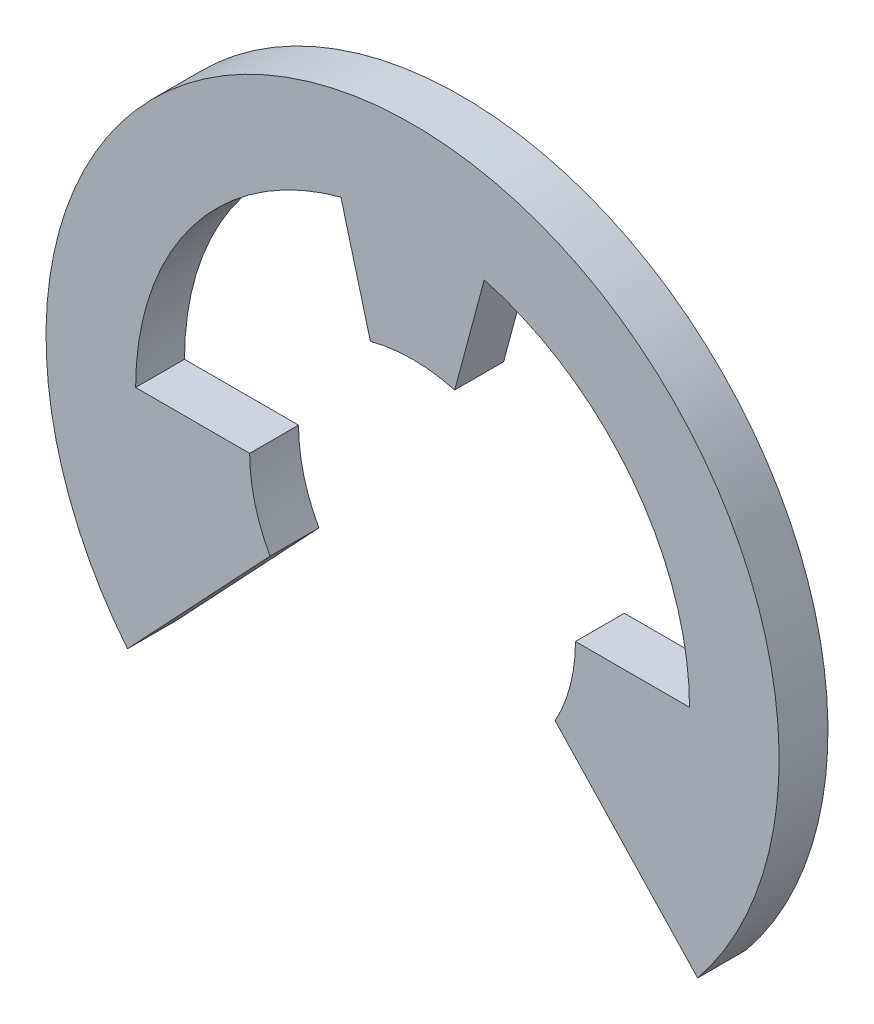
ISO-10303-21;
HEADER;
FILE_DESCRIPTION(('STEP AP214'),'2;1');
FILE_NAME('part.step','',(''),(''),'','','');
FILE_SCHEMA(('AUTOMOTIVE_DESIGN { 1 0 10303 214 1 1 1 1 }'));
ENDSEC;
DATA;
#1=APPLICATION_CONTEXT('core data for automotive mechanical design processes');
#2=APPLICATION_PROTOCOL_DEFINITION('international standard','automotive_design',2000,#1);
#3=PRODUCT_CONTEXT('',#1,'mechanical');
#4=PRODUCT('Part','Part','',(#3));
#5=PRODUCT_RELATED_PRODUCT_CATEGORY('part','',(#4));
#6=PRODUCT_DEFINITION_FORMATION('','',#4);
#7=PRODUCT_DEFINITION_CONTEXT('part definition',#1,'design');
#8=PRODUCT_DEFINITION('design','',#6,#7);
#9=PRODUCT_DEFINITION_SHAPE('','',#8);
#10=(LENGTH_UNIT() NAMED_UNIT(*) SI_UNIT(.MILLI.,.METRE.));
#11=(NAMED_UNIT(*) PLANE_ANGLE_UNIT() SI_UNIT($,.RADIAN.));
#12=(NAMED_UNIT(*) SI_UNIT($,.STERADIAN.) SOLID_ANGLE_UNIT());
#13=UNCERTAINTY_MEASURE_WITH_UNIT(LENGTH_MEASURE(1.E-05),#10,'distance_accuracy_value','');
#14=(GEOMETRIC_REPRESENTATION_CONTEXT(3) GLOBAL_UNCERTAINTY_ASSIGNED_CONTEXT((#13)) GLOBAL_UNIT_ASSIGNED_CONTEXT((#10,
#11,#12)) REPRESENTATION_CONTEXT('',''));
#15=CARTESIAN_POINT('',(0.,0.,0.));
#16=DIRECTION('',(0.,0.,1.));
#17=DIRECTION('',(1.,0.,0.));
#18=AXIS2_PLACEMENT_3D('',#15,#16,#17);
#19=CARTESIAN_POINT('',(0.,0.,0.3));
#20=DIRECTION('',(0.,0.,-1.));
#21=DIRECTION('',(-1.,0.,0.));
#22=AXIS2_PLACEMENT_3D('',#19,#20,#21);
#23=CYLINDRICAL_SURFACE('',#22,4.5);
#24=DIRECTION('',(0.,0.,-1.));
#25=VECTOR('',#24,1.);
#26=CARTESIAN_POINT('',(3.5,-2.82842712474619,0.3));
#27=LINE('',#26,#25);
#28=CARTESIAN_POINT('',(3.5,-2.82842712474619,0.3));
#29=VERTEX_POINT('',#28);
#30=CARTESIAN_POINT('',(3.5,-2.82842712474619,-0.3));
#31=VERTEX_POINT('',#30);
#32=EDGE_CURVE('E144',#29,#31,#27,.T.);
#33=ORIENTED_EDGE('',*,*,#32,.T.);
#34=CARTESIAN_POINT('',(0.,0.,-0.3));
#35=DIRECTION('',(0.,0.,1.));
#36=DIRECTION('',(1.,0.,0.));
#37=AXIS2_PLACEMENT_3D('',#34,#35,#36);
#38=CIRCLE('',#37,4.5);
#39=CARTESIAN_POINT('',(-3.5,-2.82842712474619,-0.3));
#40=VERTEX_POINT('',#39);
#41=EDGE_CURVE('E138',#31,#40,#38,.T.);
#42=ORIENTED_EDGE('',*,*,#41,.T.);
#43=DIRECTION('',(0.,0.,-1.));
#44=VECTOR('',#43,1.);
#45=CARTESIAN_POINT('',(-3.5,-2.82842712474619,0.3));
#46=LINE('',#45,#44);
#47=CARTESIAN_POINT('',(-3.5,-2.82842712474619,0.3));
#48=VERTEX_POINT('',#47);
#49=EDGE_CURVE('E11',#48,#40,#46,.T.);
#50=ORIENTED_EDGE('',*,*,#49,.F.);
#51=CARTESIAN_POINT('',(0.,0.,0.3));
#52=DIRECTION('',(0.,0.,1.));
#53=DIRECTION('',(1.,0.,0.));
#54=AXIS2_PLACEMENT_3D('',#51,#52,#53);
#55=CIRCLE('',#54,4.5);
#56=EDGE_CURVE('E174',#29,#48,#55,.T.);
#57=ORIENTED_EDGE('',*,*,#56,.F.);
#58=EDGE_LOOP('',(#33,#42,#50,#57));
#59=FACE_BOUND('',#58,.T.);
#60=ADVANCED_FACE('F38',(#59),#23,.T.);
#61=CARTESIAN_POINT('',(-3.5,-2.82842712474619,0.3));
#62=DIRECTION('',(-0.728348267599935,0.685207122762288,0.));
#63=DIRECTION('',(-0.685207122762288,-0.728348267599935,0.));
#64=AXIS2_PLACEMENT_3D('',#61,#62,#63);
#65=PLANE('',#64);
#66=ORIENTED_EDGE('',*,*,#49,.T.);
#67=DIRECTION('',(0.685207122762288,0.728348267599935,0.));
#68=VECTOR('',#67,1.);
#69=CARTESIAN_POINT('',(-3.5,-2.82842712474619,-0.3));
#70=LINE('',#69,#68);
#71=CARTESIAN_POINT('',(-1.75,-0.968245836551854,-0.3));
#72=VERTEX_POINT('',#71);
#73=EDGE_CURVE('E128',#40,#72,#70,.T.);
#74=ORIENTED_EDGE('',*,*,#73,.T.);
#75=DIRECTION('',(0.,0.,-1.));
#76=VECTOR('',#75,1.);
#77=CARTESIAN_POINT('',(-1.75,-0.968245836551854,0.3));
#78=LINE('',#77,#76);
#79=CARTESIAN_POINT('',(-1.75,-0.968245836551854,0.3));
#80=VERTEX_POINT('',#79);
#81=EDGE_CURVE('E45',#80,#72,#78,.T.);
#82=ORIENTED_EDGE('',*,*,#81,.F.);
#83=DIRECTION('',(0.685207122762288,0.728348267599935,0.));
#84=VECTOR('',#83,1.);
#85=CARTESIAN_POINT('',(-3.5,-2.82842712474619,0.3));
#86=LINE('',#85,#84);
#87=EDGE_CURVE('E129',#48,#80,#86,.T.);
#88=ORIENTED_EDGE('',*,*,#87,.F.);
#89=EDGE_LOOP('',(#66,#74,#82,#88));
#90=FACE_BOUND('',#89,.T.);
#91=ADVANCED_FACE('F126',(#90),#65,.F.);
#92=CARTESIAN_POINT('',(0.,0.,0.3));
#93=DIRECTION('',(0.,0.,-1.));
#94=DIRECTION('',(-1.,0.,0.));
#95=AXIS2_PLACEMENT_3D('',#92,#93,#94);
#96=CYLINDRICAL_SURFACE('',#95,2.);
#97=ORIENTED_EDGE('',*,*,#81,.T.);
#98=CARTESIAN_POINT('',(0.,0.,-0.3));
#99=DIRECTION('',(0.,0.,-1.));
#100=DIRECTION('',(-1.,0.,0.));
#101=AXIS2_PLACEMENT_3D('',#98,#99,#100);
#102=CIRCLE('',#101,2.);
#103=CARTESIAN_POINT('',(-2.,0.,-0.3));
#104=VERTEX_POINT('',#103);
#105=EDGE_CURVE('E142',#72,#104,#102,.T.);
#106=ORIENTED_EDGE('',*,*,#105,.T.);
#107=DIRECTION('',(0.,0.,-1.));
#108=VECTOR('',#107,1.);
#109=CARTESIAN_POINT('',(-2.,0.,0.3));
#110=LINE('',#109,#108);
#111=CARTESIAN_POINT('',(-2.,0.,0.3));
#112=VERTEX_POINT('',#111);
#113=EDGE_CURVE('E212',#112,#104,#110,.T.);
#114=ORIENTED_EDGE('',*,*,#113,.F.);
#115=CARTESIAN_POINT('',(0.,0.,0.3));
#116=DIRECTION('',(0.,0.,-1.));
#117=DIRECTION('',(-1.,0.,0.));
#118=AXIS2_PLACEMENT_3D('',#115,#116,#117);
#119=CIRCLE('',#118,2.);
#120=EDGE_CURVE('E177',#80,#112,#119,.T.);
#121=ORIENTED_EDGE('',*,*,#120,.F.);
#122=EDGE_LOOP('',(#97,#106,#114,#121));
#123=FACE_BOUND('',#122,.T.);
#124=ADVANCED_FACE('F215',(#123),#96,.F.);
#125=CARTESIAN_POINT('',(-2.,0.,0.3));
#126=DIRECTION('',(0.,-1.,0.));
#127=DIRECTION('',(0.,0.,-1.));
#128=AXIS2_PLACEMENT_3D('',#125,#126,#127);
#129=PLANE('',#128);
#130=ORIENTED_EDGE('',*,*,#113,.T.);
#131=DIRECTION('',(-1.,0.,0.));
#132=VECTOR('',#131,1.);
#133=CARTESIAN_POINT('',(-2.,0.,-0.3));
#134=LINE('',#133,#132);
#135=CARTESIAN_POINT('',(-3.4,0.,-0.3));
#136=VERTEX_POINT('',#135);
#137=EDGE_CURVE('E148',#104,#136,#134,.T.);
#138=ORIENTED_EDGE('',*,*,#137,.T.);
#139=DIRECTION('',(0.,0.,-1.));
#140=VECTOR('',#139,1.);
#141=CARTESIAN_POINT('',(-3.4,0.,0.3));
#142=LINE('',#141,#140);
#143=CARTESIAN_POINT('',(-3.4,0.,0.3));
#144=VERTEX_POINT('',#143);
#145=EDGE_CURVE('E210',#144,#136,#142,.T.);
#146=ORIENTED_EDGE('',*,*,#145,.F.);
#147=DIRECTION('',(-1.,0.,0.));
#148=VECTOR('',#147,1.);
#149=CARTESIAN_POINT('',(-2.,0.,0.3));
#150=LINE('',#149,#148);
#151=EDGE_CURVE('E179',#112,#144,#150,.T.);
#152=ORIENTED_EDGE('',*,*,#151,.F.);
#153=EDGE_LOOP('',(#130,#138,#146,#152));
#154=FACE_BOUND('',#153,.T.);
#155=ADVANCED_FACE('F223',(#154),#129,.F.);
#156=CARTESIAN_POINT('',(0.,0.,0.3));
#157=DIRECTION('',(0.,0.,-1.));
#158=DIRECTION('',(-1.,0.,0.));
#159=AXIS2_PLACEMENT_3D('',#156,#157,#158);
#160=CYLINDRICAL_SURFACE('',#159,3.4);
#161=ORIENTED_EDGE('',*,*,#145,.T.);
#162=CARTESIAN_POINT('',(0.,0.,-0.3));
#163=DIRECTION('',(0.,0.,-1.));
#164=DIRECTION('',(-1.,0.,0.));
#165=AXIS2_PLACEMENT_3D('',#162,#163,#164);
#166=CIRCLE('',#165,3.4);
#167=CARTESIAN_POINT('',(-0.879984753348571,3.28414780938283,-0.3));
#168=VERTEX_POINT('',#167);
#169=EDGE_CURVE('E151',#136,#168,#166,.T.);
#170=ORIENTED_EDGE('',*,*,#169,.T.);
#171=DIRECTION('',(0.,0.,-1.));
#172=VECTOR('',#171,1.);
#173=CARTESIAN_POINT('',(-0.879984753348571,3.28414780938283,0.3));
#174=LINE('',#173,#172);
#175=CARTESIAN_POINT('',(-0.879984753348571,3.28414780938283,0.3));
#176=VERTEX_POINT('',#175);
#177=EDGE_CURVE('E208',#176,#168,#174,.T.);
#178=ORIENTED_EDGE('',*,*,#177,.F.);
#179=CARTESIAN_POINT('',(0.,0.,0.3));
#180=DIRECTION('',(0.,0.,-1.));
#181=DIRECTION('',(-1.,0.,0.));
#182=AXIS2_PLACEMENT_3D('',#179,#180,#181);
#183=CIRCLE('',#182,3.4);
#184=EDGE_CURVE('E181',#144,#176,#183,.T.);
#185=ORIENTED_EDGE('',*,*,#184,.F.);
#186=EDGE_LOOP('',(#161,#170,#178,#185));
#187=FACE_BOUND('',#186,.T.);
#188=ADVANCED_FACE('F226',(#187),#160,.F.);
#189=CARTESIAN_POINT('',(-0.879984753348571,3.28414780938283,0.3));
#190=DIRECTION('',(0.965925826289068,0.258819045102521,0.));
#191=DIRECTION('',(-0.258819045102521,0.965925826289068,0.));
#192=AXIS2_PLACEMENT_3D('',#189,#190,#191);
#193=PLANE('',#192);
#194=ORIENTED_EDGE('',*,*,#177,.T.);
#195=DIRECTION('',(0.258819045102521,-0.965925826289068,0.));
#196=VECTOR('',#195,1.);
#197=CARTESIAN_POINT('',(-0.879984753348571,3.28414780938283,-0.3));
#198=LINE('',#197,#196);
#199=CARTESIAN_POINT('',(-0.517638090205041,1.93185165257814,-0.3));
#200=VERTEX_POINT('',#199);
#201=EDGE_CURVE('E154',#168,#200,#198,.T.);
#202=ORIENTED_EDGE('',*,*,#201,.T.);
#203=DIRECTION('',(0.,0.,-1.));
#204=VECTOR('',#203,1.);
#205=CARTESIAN_POINT('',(-0.517638090205041,1.93185165257814,0.3));
#206=LINE('',#205,#204);
#207=CARTESIAN_POINT('',(-0.517638090205041,1.93185165257814,0.3));
#208=VERTEX_POINT('',#207);
#209=EDGE_CURVE('E206',#208,#200,#206,.T.);
#210=ORIENTED_EDGE('',*,*,#209,.F.);
#211=DIRECTION('',(0.258819045102521,-0.965925826289068,0.));
#212=VECTOR('',#211,1.);
#213=CARTESIAN_POINT('',(-0.879984753348571,3.28414780938283,0.3));
#214=LINE('',#213,#212);
#215=EDGE_CURVE('E183',#176,#208,#214,.T.);
#216=ORIENTED_EDGE('',*,*,#215,.F.);
#217=EDGE_LOOP('',(#194,#202,#210,#216));
#218=FACE_BOUND('',#217,.T.);
#219=ADVANCED_FACE('F231',(#218),#193,.F.);
#220=CARTESIAN_POINT('',(0.,0.,0.3));
#221=DIRECTION('',(0.,0.,-1.));
#222=DIRECTION('',(-1.,0.,0.));
#223=AXIS2_PLACEMENT_3D('',#220,#221,#222);
#224=CYLINDRICAL_SURFACE('',#223,2.);
#225=ORIENTED_EDGE('',*,*,#209,.T.);
#226=CARTESIAN_POINT('',(0.,0.,-0.3));
#227=DIRECTION('',(0.,0.,-1.));
#228=DIRECTION('',(-1.,0.,0.));
#229=AXIS2_PLACEMENT_3D('',#226,#227,#228);
#230=CIRCLE('',#229,2.);
#231=CARTESIAN_POINT('',(0.517638090205041,1.93185165257814,-0.3));
#232=VERTEX_POINT('',#231);
#233=EDGE_CURVE('E157',#200,#232,#230,.T.);
#234=ORIENTED_EDGE('',*,*,#233,.T.);
#235=DIRECTION('',(0.,0.,-1.));
#236=VECTOR('',#235,1.);
#237=CARTESIAN_POINT('',(0.517638090205041,1.93185165257814,0.3));
#238=LINE('',#237,#236);
#239=CARTESIAN_POINT('',(0.517638090205041,1.93185165257814,0.3));
#240=VERTEX_POINT('',#239);
#241=EDGE_CURVE('E204',#240,#232,#238,.T.);
#242=ORIENTED_EDGE('',*,*,#241,.F.);
#243=CARTESIAN_POINT('',(0.,0.,0.3));
#244=DIRECTION('',(0.,0.,-1.));
#245=DIRECTION('',(-1.,0.,0.));
#246=AXIS2_PLACEMENT_3D('',#243,#244,#245);
#247=CIRCLE('',#246,2.);
#248=EDGE_CURVE('E185',#208,#240,#247,.T.);
#249=ORIENTED_EDGE('',*,*,#248,.F.);
#250=EDGE_LOOP('',(#225,#234,#242,#249));
#251=FACE_BOUND('',#250,.T.);
#252=ADVANCED_FACE('F237',(#251),#224,.F.);
#253=CARTESIAN_POINT('',(0.517638090205041,1.93185165257814,0.3));
#254=DIRECTION('',(-0.965925826289068,0.258819045102521,0.));
#255=DIRECTION('',(-0.258819045102521,-0.965925826289068,0.));
#256=AXIS2_PLACEMENT_3D('',#253,#254,#255);
#257=PLANE('',#256);
#258=ORIENTED_EDGE('',*,*,#241,.T.);
#259=DIRECTION('',(0.258819045102521,0.965925826289068,0.));
#260=VECTOR('',#259,1.);
#261=CARTESIAN_POINT('',(0.517638090205041,1.93185165257814,-0.3));
#262=LINE('',#261,#260);
#263=CARTESIAN_POINT('',(0.879984753348571,3.28414780938283,-0.3));
#264=VERTEX_POINT('',#263);
#265=EDGE_CURVE('E160',#232,#264,#262,.T.);
#266=ORIENTED_EDGE('',*,*,#265,.T.);
#267=DIRECTION('',(0.,0.,-1.));
#268=VECTOR('',#267,1.);
#269=CARTESIAN_POINT('',(0.879984753348571,3.28414780938283,0.3));
#270=LINE('',#269,#268);
#271=CARTESIAN_POINT('',(0.879984753348571,3.28414780938283,0.3));
#272=VERTEX_POINT('',#271);
#273=EDGE_CURVE('E202',#272,#264,#270,.T.);
#274=ORIENTED_EDGE('',*,*,#273,.F.);
#275=DIRECTION('',(0.258819045102521,0.965925826289068,0.));
#276=VECTOR('',#275,1.);
#277=CARTESIAN_POINT('',(0.517638090205041,1.93185165257814,0.3));
#278=LINE('',#277,#276);
#279=EDGE_CURVE('E187',#240,#272,#278,.T.);
#280=ORIENTED_EDGE('',*,*,#279,.F.);
#281=EDGE_LOOP('',(#258,#266,#274,#280));
#282=FACE_BOUND('',#281,.T.);
#283=ADVANCED_FACE('F241',(#282),#257,.F.);
#284=CARTESIAN_POINT('',(0.,0.,0.3));
#285=DIRECTION('',(0.,0.,-1.));
#286=DIRECTION('',(-1.,0.,0.));
#287=AXIS2_PLACEMENT_3D('',#284,#285,#286);
#288=CYLINDRICAL_SURFACE('',#287,3.4);
#289=ORIENTED_EDGE('',*,*,#273,.T.);
#290=CARTESIAN_POINT('',(0.,0.,-0.3));
#291=DIRECTION('',(0.,0.,-1.));
#292=DIRECTION('',(-1.,0.,0.));
#293=AXIS2_PLACEMENT_3D('',#290,#291,#292);
#294=CIRCLE('',#293,3.4);
#295=CARTESIAN_POINT('',(3.4,0.,-0.3));
#296=VERTEX_POINT('',#295);
#297=EDGE_CURVE('E163',#264,#296,#294,.T.);
#298=ORIENTED_EDGE('',*,*,#297,.T.);
#299=DIRECTION('',(0.,0.,-1.));
#300=VECTOR('',#299,1.);
#301=CARTESIAN_POINT('',(3.4,0.,0.3));
#302=LINE('',#301,#300);
#303=CARTESIAN_POINT('',(3.4,0.,0.3));
#304=VERTEX_POINT('',#303);
#305=EDGE_CURVE('E200',#304,#296,#302,.T.);
#306=ORIENTED_EDGE('',*,*,#305,.F.);
#307=CARTESIAN_POINT('',(0.,0.,0.3));
#308=DIRECTION('',(0.,0.,-1.));
#309=DIRECTION('',(-1.,0.,0.));
#310=AXIS2_PLACEMENT_3D('',#307,#308,#309);
#311=CIRCLE('',#310,3.4);
#312=EDGE_CURVE('E189',#272,#304,#311,.T.);
#313=ORIENTED_EDGE('',*,*,#312,.F.);
#314=EDGE_LOOP('',(#289,#298,#306,#313));
#315=FACE_BOUND('',#314,.T.);
#316=ADVANCED_FACE('F246',(#315),#288,.F.);
#317=CARTESIAN_POINT('',(3.4,0.,0.3));
#318=DIRECTION('',(0.,-1.,0.));
#319=DIRECTION('',(0.,0.,-1.));
#320=AXIS2_PLACEMENT_3D('',#317,#318,#319);
#321=PLANE('',#320);
#322=ORIENTED_EDGE('',*,*,#305,.T.);
#323=DIRECTION('',(-1.,0.,0.));
#324=VECTOR('',#323,1.);
#325=CARTESIAN_POINT('',(3.4,0.,-0.3));
#326=LINE('',#325,#324);
#327=CARTESIAN_POINT('',(2.,0.,-0.3));
#328=VERTEX_POINT('',#327);
#329=EDGE_CURVE('E166',#296,#328,#326,.T.);
#330=ORIENTED_EDGE('',*,*,#329,.T.);
#331=DIRECTION('',(0.,0.,-1.));
#332=VECTOR('',#331,1.);
#333=CARTESIAN_POINT('',(2.,0.,0.3));
#334=LINE('',#333,#332);
#335=CARTESIAN_POINT('',(2.,0.,0.3));
#336=VERTEX_POINT('',#335);
#337=EDGE_CURVE('E198',#336,#328,#334,.T.);
#338=ORIENTED_EDGE('',*,*,#337,.F.);
#339=DIRECTION('',(-1.,0.,0.));
#340=VECTOR('',#339,1.);
#341=CARTESIAN_POINT('',(3.4,0.,0.3));
#342=LINE('',#341,#340);
#343=EDGE_CURVE('E191',#304,#336,#342,.T.);
#344=ORIENTED_EDGE('',*,*,#343,.F.);
#345=EDGE_LOOP('',(#322,#330,#338,#344));
#346=FACE_BOUND('',#345,.T.);
#347=ADVANCED_FACE('F250',(#346),#321,.F.);
#348=CARTESIAN_POINT('',(0.,0.,0.3));
#349=DIRECTION('',(0.,0.,-1.));
#350=DIRECTION('',(-1.,0.,0.));
#351=AXIS2_PLACEMENT_3D('',#348,#349,#350);
#352=CYLINDRICAL_SURFACE('',#351,2.);
#353=ORIENTED_EDGE('',*,*,#337,.T.);
#354=CARTESIAN_POINT('',(0.,0.,-0.3));
#355=DIRECTION('',(0.,0.,-1.));
#356=DIRECTION('',(-1.,0.,0.));
#357=AXIS2_PLACEMENT_3D('',#354,#355,#356);
#358=CIRCLE('',#357,2.);
#359=CARTESIAN_POINT('',(1.75,-0.968245836551854,-0.3));
#360=VERTEX_POINT('',#359);
#361=EDGE_CURVE('E169',#328,#360,#358,.T.);
#362=ORIENTED_EDGE('',*,*,#361,.T.);
#363=DIRECTION('',(0.,0.,-1.));
#364=VECTOR('',#363,1.);
#365=CARTESIAN_POINT('',(1.75,-0.968245836551854,0.3));
#366=LINE('',#365,#364);
#367=CARTESIAN_POINT('',(1.75,-0.968245836551854,0.3));
#368=VERTEX_POINT('',#367);
#369=EDGE_CURVE('E196',#368,#360,#366,.T.);
#370=ORIENTED_EDGE('',*,*,#369,.F.);
#371=CARTESIAN_POINT('',(0.,0.,0.3));
#372=DIRECTION('',(0.,0.,-1.));
#373=DIRECTION('',(-1.,0.,0.));
#374=AXIS2_PLACEMENT_3D('',#371,#372,#373);
#375=CIRCLE('',#374,2.);
#376=EDGE_CURVE('E57',#336,#368,#375,.T.);
#377=ORIENTED_EDGE('',*,*,#376,.F.);
#378=EDGE_LOOP('',(#353,#362,#370,#377));
#379=FACE_BOUND('',#378,.T.);
#380=ADVANCED_FACE('F254',(#379),#352,.F.);
#381=CARTESIAN_POINT('',(1.75,-0.968245836551854,0.3));
#382=DIRECTION('',(0.728348267599936,0.685207122762288,0.));
#383=DIRECTION('',(-0.685207122762288,0.728348267599936,0.));
#384=AXIS2_PLACEMENT_3D('',#381,#382,#383);
#385=PLANE('',#384);
#386=ORIENTED_EDGE('',*,*,#369,.T.);
#387=DIRECTION('',(0.685207122762288,-0.728348267599935,0.));
#388=VECTOR('',#387,1.);
#389=CARTESIAN_POINT('',(1.75,-0.968245836551854,-0.3));
#390=LINE('',#389,#388);
#391=EDGE_CURVE('E172',#360,#31,#390,.T.);
#392=ORIENTED_EDGE('',*,*,#391,.T.);
#393=ORIENTED_EDGE('',*,*,#32,.F.);
#394=DIRECTION('',(0.685207122762288,-0.728348267599935,0.));
#395=VECTOR('',#394,1.);
#396=CARTESIAN_POINT('',(1.75,-0.968245836551854,0.3));
#397=LINE('',#396,#395);
#398=EDGE_CURVE('E52',#368,#29,#397,.T.);
#399=ORIENTED_EDGE('',*,*,#398,.F.);
#400=EDGE_LOOP('',(#386,#392,#393,#399));
#401=FACE_BOUND('',#400,.T.);
#402=ADVANCED_FACE('F256',(#401),#385,.F.);
#403=CARTESIAN_POINT('',(0.,0.,0.3));
#404=DIRECTION('',(0.,0.,1.));
#405=DIRECTION('',(1.,0.,0.));
#406=AXIS2_PLACEMENT_3D('',#403,#404,#405);
#407=PLANE('',#406);
#408=ORIENTED_EDGE('',*,*,#56,.T.);
#409=ORIENTED_EDGE('',*,*,#87,.T.);
#410=ORIENTED_EDGE('',*,*,#120,.T.);
#411=ORIENTED_EDGE('',*,*,#151,.T.);
#412=ORIENTED_EDGE('',*,*,#184,.T.);
#413=ORIENTED_EDGE('',*,*,#215,.T.);
#414=ORIENTED_EDGE('',*,*,#248,.T.);
#415=ORIENTED_EDGE('',*,*,#279,.T.);
#416=ORIENTED_EDGE('',*,*,#312,.T.);
#417=ORIENTED_EDGE('',*,*,#343,.T.);
#418=ORIENTED_EDGE('',*,*,#376,.T.);
#419=ORIENTED_EDGE('',*,*,#398,.T.);
#420=EDGE_LOOP('',(#408,#409,#410,#411,#412,#413,#414,#415,#416,#417,#418,#419));
#421=FACE_BOUND('',#420,.T.);
#422=ADVANCED_FACE('F218',(#421),#407,.T.);
#423=CARTESIAN_POINT('',(0.,0.,-0.3));
#424=DIRECTION('',(0.,0.,1.));
#425=DIRECTION('',(1.,0.,0.));
#426=AXIS2_PLACEMENT_3D('',#423,#424,#425);
#427=PLANE('',#426);
#428=ORIENTED_EDGE('',*,*,#41,.F.);
#429=ORIENTED_EDGE('',*,*,#391,.F.);
#430=ORIENTED_EDGE('',*,*,#361,.F.);
#431=ORIENTED_EDGE('',*,*,#329,.F.);
#432=ORIENTED_EDGE('',*,*,#297,.F.);
#433=ORIENTED_EDGE('',*,*,#265,.F.);
#434=ORIENTED_EDGE('',*,*,#233,.F.);
#435=ORIENTED_EDGE('',*,*,#201,.F.);
#436=ORIENTED_EDGE('',*,*,#169,.F.);
#437=ORIENTED_EDGE('',*,*,#137,.F.);
#438=ORIENTED_EDGE('',*,*,#105,.F.);
#439=ORIENTED_EDGE('',*,*,#73,.F.);
#440=EDGE_LOOP('',(#428,#429,#430,#431,#432,#433,#434,#435,#436,#437,#438,#439));
#441=FACE_BOUND('',#440,.T.);
#442=ADVANCED_FACE('F136',(#441),#427,.F.);
#443=CLOSED_SHELL('',(#60,#91,#124,#155,#188,#219,#252,#283,#316,#347,#380,#402,#422,#442));
#444=MANIFOLD_SOLID_BREP('B2',#443);
#445=ADVANCED_BREP_SHAPE_REPRESENTATION('',(#18,#444),#14);
#446=SHAPE_DEFINITION_REPRESENTATION(#9,#445);
ENDSEC;
END-ISO-10303-21;
